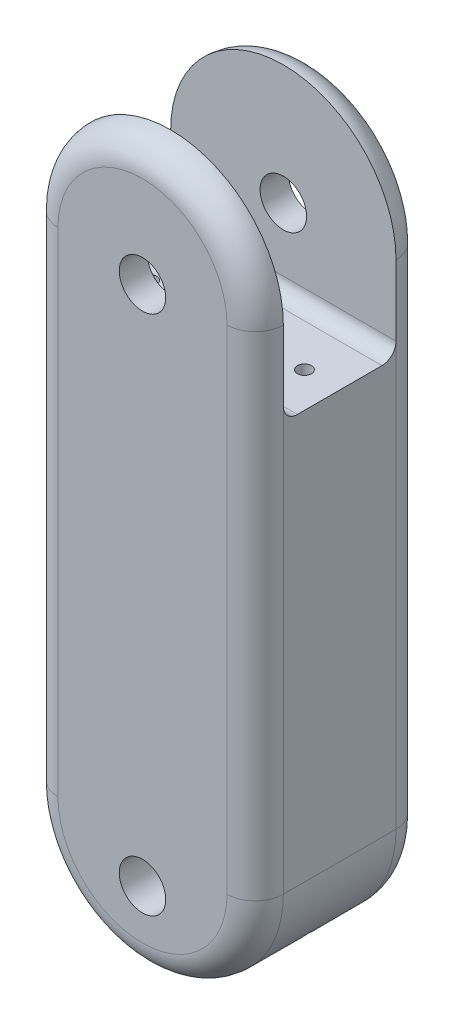
ISO-10303-21;
HEADER;
FILE_DESCRIPTION(('STEP AP214'),'2;1');
FILE_NAME('part.step','',(''),(''),'','','');
FILE_SCHEMA(('AUTOMOTIVE_DESIGN { 1 0 10303 214 1 1 1 1 }'));
ENDSEC;
DATA;
#1=APPLICATION_CONTEXT('core data for automotive mechanical design processes');
#2=APPLICATION_PROTOCOL_DEFINITION('international standard','automotive_design',2000,#1);
#3=PRODUCT_CONTEXT('',#1,'mechanical');
#4=PRODUCT('Part','Part','',(#3));
#5=PRODUCT_RELATED_PRODUCT_CATEGORY('part','',(#4));
#6=PRODUCT_DEFINITION_FORMATION('','',#4);
#7=PRODUCT_DEFINITION_CONTEXT('part definition',#1,'design');
#8=PRODUCT_DEFINITION('design','',#6,#7);
#9=PRODUCT_DEFINITION_SHAPE('','',#8);
#10=(LENGTH_UNIT() NAMED_UNIT(*) SI_UNIT(.MILLI.,.METRE.));
#11=(NAMED_UNIT(*) PLANE_ANGLE_UNIT() SI_UNIT($,.RADIAN.));
#12=(NAMED_UNIT(*) SI_UNIT($,.STERADIAN.) SOLID_ANGLE_UNIT());
#13=UNCERTAINTY_MEASURE_WITH_UNIT(LENGTH_MEASURE(1.E-05),#10,'distance_accuracy_value','');
#14=(GEOMETRIC_REPRESENTATION_CONTEXT(3) GLOBAL_UNCERTAINTY_ASSIGNED_CONTEXT((#13)) GLOBAL_UNIT_ASSIGNED_CONTEXT((#10,
#11,#12)) REPRESENTATION_CONTEXT('',''));
#15=CARTESIAN_POINT('',(0.,0.,0.));
#16=DIRECTION('',(0.,0.,1.));
#17=DIRECTION('',(1.,0.,0.));
#18=AXIS2_PLACEMENT_3D('',#15,#16,#17);
#19=CARTESIAN_POINT('',(0.,-17.5,12.));
#20=DIRECTION('',(0.,0.,-1.));
#21=DIRECTION('',(-1.,0.,0.));
#22=AXIS2_PLACEMENT_3D('',#19,#20,#21);
#23=CYLINDRICAL_SURFACE('',#22,8.);
#24=CARTESIAN_POINT('',(-5.5,-23.3094750193111,5.5));
#25=CARTESIAN_POINT('',(-5.53883256297377,-23.2727099644717,5.49999879672875));
#26=CARTESIAN_POINT('',(-5.57735205571063,-23.2354974126199,5.50451254597471));
#27=CARTESIAN_POINT('',(-5.65269349993185,-23.1612598829696,5.5223075775329));
#28=CARTESIAN_POINT('',(-5.68951035065368,-23.1242357315899,5.53561358205599));
#29=CARTESIAN_POINT('',(-5.75197235969459,-23.0602450287539,5.56706863233885));
#30=CARTESIAN_POINT('',(-5.77821785024123,-23.032949773077,5.58335966591231));
#31=CARTESIAN_POINT('',(-5.8282935252695,-22.9801739318678,5.62156552138405));
#32=CARTESIAN_POINT('',(-5.85212973167694,-22.9546888717723,5.6434658127327));
#33=CARTESIAN_POINT('',(-5.88931760375126,-22.9144655062157,5.68543916786667));
#34=CARTESIAN_POINT('',(-5.90359469668008,-22.8988848324599,5.70388319535616));
#35=CARTESIAN_POINT('',(-5.93001297945982,-22.8698536903953,5.74375981298753));
#36=CARTESIAN_POINT('',(-5.94215707291109,-22.8564003287571,5.76518826807908));
#37=CARTESIAN_POINT('',(-5.96119445181301,-22.8351961083864,5.80587350809099));
#38=CARTESIAN_POINT('',(-5.96865471270215,-22.8268426872149,5.82454715530106));
#39=CARTESIAN_POINT('',(-5.98143524298382,-22.8124876512401,5.8634767593147));
#40=CARTESIAN_POINT('',(-5.98675726165213,-22.8064841141228,5.88373140644802));
#41=CARTESIAN_POINT('',(-5.99489142766223,-22.7972932651513,5.92557021613187));
#42=CARTESIAN_POINT('',(-5.99768115031207,-22.7941311175938,5.94716448210675));
#43=CARTESIAN_POINT('',(-6.00039021795333,-22.7910605903332,5.99075858651718));
#44=CARTESIAN_POINT('',(-6.00031156426424,-22.7911499419984,6.01275813147077));
#45=CARTESIAN_POINT('',(-5.99750441665795,-22.7943312543776,6.05335898481825));
#46=CARTESIAN_POINT('',(-5.99513330798205,-22.7970182476523,6.07201979429985));
#47=CARTESIAN_POINT('',(-5.98843422457456,-22.8045905544454,6.10852080843235));
#48=CARTESIAN_POINT('',(-5.98410540861174,-22.8094768129887,6.12636065667981));
#49=CARTESIAN_POINT('',(-5.97218023126853,-22.8228906924312,6.16612443094749));
#50=CARTESIAN_POINT('',(-5.96399127830456,-22.8320729903809,6.18764849987729));
#51=CARTESIAN_POINT('',(-5.94534255019942,-22.8528588186709,6.22841879831762));
#52=CARTESIAN_POINT('',(-5.93487851417378,-22.8644668905102,6.24766064763471));
#53=CARTESIAN_POINT('',(-5.90754100513332,-22.8945825657835,6.29123292830556));
#54=CARTESIAN_POINT('',(-5.88979990908874,-22.9139661627167,6.31440902025144));
#55=CARTESIAN_POINT('',(-5.85186754242314,-22.9549457188014,6.35635874950463));
#56=CARTESIAN_POINT('',(-5.83167159128333,-22.9765458915543,6.37512377023639));
#57=CARTESIAN_POINT('',(-5.78115974125141,-23.0299199268934,6.4151616669722));
#58=CARTESIAN_POINT('',(-5.7499964295665,-23.0623435370145,6.43449967040374));
#59=CARTESIAN_POINT('',(-5.685354817012,-23.1284000437262,6.46576101145348));
#60=CARTESIAN_POINT('',(-5.65187430109036,-23.1620340822244,6.47767714250449));
#61=CARTESIAN_POINT('',(-5.582742557998,-23.230217005972,6.49441100760347));
#62=CARTESIAN_POINT('',(-5.54706174850995,-23.2647709485254,6.49908592798175));
#63=CARTESIAN_POINT('',(-5.47496826288831,-23.3332829586401,6.50067138267121));
#64=CARTESIAN_POINT('',(-5.43855606152765,-23.3672413875578,6.49758680204824));
#65=CARTESIAN_POINT('',(-5.37138828886743,-23.4287390627056,6.48420183357968));
#66=CARTESIAN_POINT('',(-5.34059474360656,-23.4564833624482,6.47503953853532));
#67=CARTESIAN_POINT('',(-5.28007246941309,-23.5101965434781,6.45022077197024));
#68=CARTESIAN_POINT('',(-5.25034247386237,-23.5361675725655,6.4345723250903));
#69=CARTESIAN_POINT('',(-5.1999351718502,-23.5795978904278,6.40081430911797));
#70=CARTESIAN_POINT('',(-5.17877520682592,-23.5976210210313,6.38415302845264));
#71=CARTESIAN_POINT('',(-5.13858578146666,-23.6315270378339,6.34660273470643));
#72=CARTESIAN_POINT('',(-5.11955351431307,-23.6474127494473,6.32571939597419));
#73=CARTESIAN_POINT('',(-5.08793285310306,-23.673595309223,6.28415951112696));
#74=CARTESIAN_POINT('',(-5.07480756880788,-23.6843803498436,6.26420125834377));
#75=CARTESIAN_POINT('',(-5.05120787557602,-23.70367079713,6.22175244043886));
#76=CARTESIAN_POINT('',(-5.04073247310847,-23.7121770582587,6.19926282899316));
#77=CARTESIAN_POINT('',(-5.02299868867453,-23.7265252507662,6.15202151475749));
#78=CARTESIAN_POINT('',(-5.0157652129964,-23.732346564483,6.12725400337554));
#79=CARTESIAN_POINT('',(-5.00518832922849,-23.7408442913639,6.07638301816265));
#80=CARTESIAN_POINT('',(-5.00184172639809,-23.7435232873139,6.0502806599352));
#81=CARTESIAN_POINT('',(-4.99947572888507,-23.7454177998222,6.00114190299521));
#82=CARTESIAN_POINT('',(-4.99995481900044,-23.745034720617,5.97814330419247));
#83=CARTESIAN_POINT('',(-5.00403554594136,-23.741765381175,5.93261092829059));
#84=CARTESIAN_POINT('',(-5.00763661122035,-23.738879579117,5.91007706688401));
#85=CARTESIAN_POINT('',(-5.01756034911261,-23.7309009327461,5.86685443175315));
#86=CARTESIAN_POINT('',(-5.02378810708933,-23.7258850194844,5.84612917046266));
#87=CARTESIAN_POINT('',(-5.03861228278507,-23.713893852922,5.80615403202124));
#88=CARTESIAN_POINT('',(-5.04720918711048,-23.706918197098,5.78690445900585));
#89=CARTESIAN_POINT('',(-5.06729535570739,-23.6905331154862,5.74844339670633));
#90=CARTESIAN_POINT('',(-5.0789808850677,-23.6809562483116,5.72940656983951));
#91=CARTESIAN_POINT('',(-5.10423221663889,-23.6601203224895,5.69365394991183));
#92=CARTESIAN_POINT('',(-5.11779910542108,-23.6488602914428,5.67693950938438));
#93=CARTESIAN_POINT('',(-5.1531257218155,-23.6193171278474,5.63855456909254));
#94=CARTESIAN_POINT('',(-5.17572801128406,-23.6002291877584,5.6182731424086));
#95=CARTESIAN_POINT('',(-5.22290977634233,-23.5598831551059,5.5827503210757));
#96=CARTESIAN_POINT('',(-5.24749423444183,-23.5386195551745,5.56752215271988));
#97=CARTESIAN_POINT('',(-5.3052046552317,-23.4880442016727,5.53805532760432));
#98=CARTESIAN_POINT('',(-5.33870403095206,-23.4582138910611,5.5254452619614));
#99=CARTESIAN_POINT('',(-5.40616571613404,-23.3970707582578,5.5076480432556));
#100=CARTESIAN_POINT('',(-5.44012718231574,-23.3657604309696,5.50244882830458));
#101=CARTESIAN_POINT('',(-5.48258851597526,-23.3259221672355,5.50022704975757));
#102=CARTESIAN_POINT('',(-5.49130211120065,-23.3177098185159,5.500000269514));
#103=CARTESIAN_POINT('',(-5.5,-23.3094750193111,5.5));
#104=B_SPLINE_CURVE_WITH_KNOTS('',3,(#24,#25,#26,#27,#28,#29,#30,#31,#32,#33,#34,#35,#36,#37,
#38,#39,#40,#41,#42,#43,#44,#45,#46,#47,#48,#49,#50,#51,#52,#53,#54,#55,#56,#57,#58,#59,#60,#61,
#62,#63,#64,#65,#66,#67,#68,#69,#70,#71,#72,#73,#74,#75,#76,#77,#78,#79,#80,#81,#82,#83,#84,#85,
#86,#87,#88,#89,#90,#91,#92,#93,#94,#95,#96,#97,#98,#99,#100,#101,#102,#103),.UNSPECIFIED.,.T.,
.F.,(4,2,2,2,2,2,2,2,2,2,2,2,2,2,2,2,2,2,2,2,2,2,2,2,2,2,2,2,2,2,2,2,2,2,2,2,2,2,2,4),(0.,
0.160400421654199,0.321253790145869,0.444523334107418,0.567476727321627,0.651377206429806,
0.735162573428372,0.800243346398788,0.865270768458753,0.930868575645866,0.996420614899836,
1.05316673131107,1.10993725485826,1.18390480724735,1.25801210158641,1.36254565386125,
1.46728173567749,1.61336869127029,1.75959727566321,1.9086746844034,2.05765826356869,
2.18454483404461,2.31127488733741,2.40814934958351,2.50489447009822,2.58321182065935,
2.6614997637126,2.74037925992162,2.8191938766565,2.88786424252104,2.95652203941122,
3.02288676445781,3.08926513053515,3.1619010670859,3.23457913030363,3.34159226565763,
3.44888332543212,3.5879482408201,3.72678655491656,3.76271374910819),.UNSPECIFIED.);
#105=CARTESIAN_POINT('',(-5.5,-23.3094750193111,5.5));
#106=VERTEX_POINT('',#105);
#107=EDGE_CURVE('E189',#106,#106,#104,.T.);
#108=ORIENTED_EDGE('',*,*,#107,.T.);
#109=EDGE_LOOP('',(#108));
#110=FACE_BOUND('',#109,.T.);
#111=CARTESIAN_POINT('',(5.5,-23.3094750193111,5.5));
#112=CARTESIAN_POINT('',(5.4693514488441,-23.3384911049883,5.50000000587435));
#113=CARTESIAN_POINT('',(5.43847210450164,-23.36726284631,5.50281006000517));
#114=CARTESIAN_POINT('',(5.37681776875911,-23.4238144984797,5.514396895186));
#115=CARTESIAN_POINT('',(5.34604291708679,-23.4515933604469,5.5231798006726));
#116=CARTESIAN_POINT('',(5.28898118698397,-23.5023299890249,5.54579570321477));
#117=CARTESIAN_POINT('',(5.26258579378557,-23.5254744395668,5.55893013922857));
#118=CARTESIAN_POINT('',(5.21140984004913,-23.5697897359983,5.59058798974798));
#119=CARTESIAN_POINT('',(5.18662706108292,-23.5909633112124,5.60910380084695));
#120=CARTESIAN_POINT('',(5.14486940305621,-23.6262467872822,5.64715589441657));
#121=CARTESIAN_POINT('',(5.12736410777177,-23.6408946933835,5.66560842675688));
#122=CARTESIAN_POINT('',(5.09476521273246,-23.6679668363479,5.70596718590084));
#123=CARTESIAN_POINT('',(5.07966885339946,-23.680393619628,5.72786940287191));
#124=CARTESIAN_POINT('',(5.05496645666452,-23.7006069391254,5.7709678851414));
#125=CARTESIAN_POINT('',(5.04486504316474,-23.7088213001872,5.79167810330463));
#126=CARTESIAN_POINT('',(5.02744029982053,-23.7229390368501,5.83498207258515));
#127=CARTESIAN_POINT('',(5.02011571512453,-23.7288434563544,5.85757496727519));
#128=CARTESIAN_POINT('',(5.00867164163467,-23.7380496676546,5.90421081489236));
#129=CARTESIAN_POINT('',(5.00456924464357,-23.7413375816311,5.92826078124137));
#130=CARTESIAN_POINT('',(4.99993625876061,-23.7450497922393,5.97691987557887));
#131=CARTESIAN_POINT('',(4.9994043309931,-23.745475162285,6.00152879049575));
#132=CARTESIAN_POINT('',(5.00182927896958,-23.7435330644825,6.04817625316485));
#133=CARTESIAN_POINT('',(5.00446984575769,-23.7414188103187,6.07024307642512));
#134=CARTESIAN_POINT('',(5.01255691708917,-23.7349257999446,6.11350570602716));
#135=CARTESIAN_POINT('',(5.01800344085411,-23.7305470282218,6.13470150640111));
#136=CARTESIAN_POINT('',(5.03150403005463,-23.7196497408173,6.17604610712552));
#137=CARTESIAN_POINT('',(5.03959787800737,-23.7130985571149,6.19617311370239));
#138=CARTESIAN_POINT('',(5.05796944367835,-23.698151749938,6.23465778292564));
#139=CARTESIAN_POINT('',(5.0682478397992,-23.6897555534746,6.25301489335776));
#140=CARTESIAN_POINT('',(5.09202868876713,-23.6702114407559,6.29000595377509));
#141=CARTESIAN_POINT('',(5.10577635659326,-23.6588479102492,6.30836733457013));
#142=CARTESIAN_POINT('',(5.13499274561139,-23.6345099791823,6.34245402748291));
#143=CARTESIAN_POINT('',(5.15046273133733,-23.621534394223,6.35817738123119));
#144=CARTESIAN_POINT('',(5.19091316720047,-23.587317156449,6.39437581419328));
#145=CARTESIAN_POINT('',(5.21670840067246,-23.5652441225023,6.41316340948417));
#146=CARTESIAN_POINT('',(5.26994860666493,-23.5190442241523,6.44502012893026));
#147=CARTESIAN_POINT('',(5.29739698406806,-23.4949130750909,6.45807695749361));
#148=CARTESIAN_POINT('',(5.36070915948433,-23.4384382910494,6.48169705872594));
#149=CARTESIAN_POINT('',(5.39681087527642,-23.4056615490579,6.49058640002565));
#150=CARTESIAN_POINT('',(5.46896400829757,-23.3389089494067,6.50036446719086));
#151=CARTESIAN_POINT('',(5.50501536169125,-23.3049321482253,6.50124675047985));
#152=CARTESIAN_POINT('',(5.57659257840669,-23.2362101623473,6.49541785729519));
#153=CARTESIAN_POINT('',(5.61210653863349,-23.2014606661879,6.48861322675467));
#154=CARTESIAN_POINT('',(5.68132659211098,-23.1324869306568,6.46736637474426));
#155=CARTESIAN_POINT('',(5.71503358940908,-23.0982624348561,6.45292801256057));
#156=CARTESIAN_POINT('',(5.77260044519866,-23.0388091902603,6.42015809843284));
#157=CARTESIAN_POINT('',(5.7970008785259,-23.0132509935388,6.40337023426044));
#158=CARTESIAN_POINT('',(5.84346338396224,-22.9639796128582,6.36461774416388));
#159=CARTESIAN_POINT('',(5.86552931323936,-22.9402634032928,6.34266185698969));
#160=CARTESIAN_POINT('',(5.90010285479502,-22.9027057381005,6.30069100353768));
#161=CARTESIAN_POINT('',(5.91347638165934,-22.8880547846062,6.28211675388431));
#162=CARTESIAN_POINT('',(5.93807629829934,-22.8609311712768,6.2421522973622));
#163=CARTESIAN_POINT('',(5.9493059092586,-22.8484552460013,6.22076639789113));
#164=CARTESIAN_POINT('',(5.96679316909567,-22.8289317078013,6.18022175325707));
#165=CARTESIAN_POINT('',(5.97360096014232,-22.8212936278479,6.16158804284965));
#166=CARTESIAN_POINT('',(5.98508173890762,-22.8083774913735,6.12288952092716));
#167=CARTESIAN_POINT('',(5.98975650195731,-22.8030974723032,6.1028259156635));
#168=CARTESIAN_POINT('',(5.99663700562942,-22.7953161211715,6.06157561407477));
#169=CARTESIAN_POINT('',(5.99882360261543,-22.7928363348466,6.0403815060472));
#170=CARTESIAN_POINT('',(6.00044893260137,-22.7909937218479,5.99775510339826));
#171=CARTESIAN_POINT('',(5.99988889181081,-22.7916295042589,5.97632291932667));
#172=CARTESIAN_POINT('',(5.99630882591312,-22.7956855816912,5.93652167932407));
#173=CARTESIAN_POINT('',(5.99358612675674,-22.798769300893,5.91808902041954));
#174=CARTESIAN_POINT('',(5.986249151674,-22.8070567726195,5.88210400390448));
#175=CARTESIAN_POINT('',(5.98163405335148,-22.8122614468598,5.86455203274874));
#176=CARTESIAN_POINT('',(5.96892276591119,-22.8265448227128,5.82483813780179));
#177=CARTESIAN_POINT('',(5.96017628186824,-22.8363392570561,5.80314279317929));
#178=CARTESIAN_POINT('',(5.94039943859182,-22.8583462233809,5.76215802277479));
#179=CARTESIAN_POINT('',(5.92936466167342,-22.8705634306452,5.74287336813827));
#180=CARTESIAN_POINT('',(5.90056558653981,-22.9022171769346,5.69918599830357));
#181=CARTESIAN_POINT('',(5.88191596971036,-22.922537260163,5.67601157708692));
#182=CARTESIAN_POINT('',(5.84214902252936,-22.9653596946459,5.63425666408036));
#183=CARTESIAN_POINT('',(5.82102616925349,-22.9878669101264,5.61568675407096));
#184=CARTESIAN_POINT('',(5.76857810956678,-23.0430540017002,5.57655268533856));
#185=CARTESIAN_POINT('',(5.73643621273076,-23.0763375298144,5.55793297801852));
#186=CARTESIAN_POINT('',(5.66995005718209,-23.143927718762,5.52836564591651));
#187=CARTESIAN_POINT('',(5.63560796577752,-23.1782333554681,5.51741059412157));
#188=CARTESIAN_POINT('',(5.56755090286688,-23.2449553312211,5.50344128970893));
#189=CARTESIAN_POINT('',(5.53391677093154,-23.2773647924285,5.49999999349923));
#190=CARTESIAN_POINT('',(5.5,-23.3094750193111,5.5));
#191=B_SPLINE_CURVE_WITH_KNOTS('',3,(#111,#112,#113,#114,#115,#116,#117,#118,#119,#120,#121,
#122,#123,#124,#125,#126,#127,#128,#129,#130,#131,#132,#133,#134,#135,#136,#137,#138,#139,#140,
#141,#142,#143,#144,#145,#146,#147,#148,#149,#150,#151,#152,#153,#154,#155,#156,#157,#158,#159,
#160,#161,#162,#163,#164,#165,#166,#167,#168,#169,#170,#171,#172,#173,#174,#175,#176,#177,#178,
#179,#180,#181,#182,#183,#184,#185,#186,#187,#188,#189,#190),.UNSPECIFIED.,.T.,.F.,(4,2,2,2,2,2,
2,2,2,2,2,2,2,2,2,2,2,2,2,2,2,2,2,2,2,2,2,2,2,2,2,2,2,2,2,2,2,2,2,4),(0.,0.126510708124238,
0.253151333659962,0.365198802151934,0.477088720788121,0.564817183467523,0.65244441513801,
0.725529562643823,0.798581643421685,0.872018653523055,0.945428124241479,1.01208735995122,
1.07874705230062,1.1464584085281,1.21419082304813,1.29070315134876,1.36727203050999,
1.48303462422496,1.59904439139826,1.74696620648305,1.89500703072202,2.04486722192175,
2.19465172260103,2.31165393209814,2.42845970290495,2.50973930985438,2.59089581808844,
2.65442657028613,2.7179043485993,2.78186728306515,2.84580166450636,2.9022102936226,
2.95864346274576,3.03430202145888,3.11010802648153,3.21758820214393,3.32531313875758,
3.47415770184575,3.62285783478946,3.76285905983959),.UNSPECIFIED.);
#192=CARTESIAN_POINT('',(5.5,-23.3094750193111,5.5));
#193=VERTEX_POINT('',#192);
#194=EDGE_CURVE('E188',#193,#193,#191,.T.);
#195=ORIENTED_EDGE('',*,*,#194,.T.);
#196=EDGE_LOOP('',(#195));
#197=FACE_BOUND('',#196,.T.);
#198=DIRECTION('',(0.,0.,-1.));
#199=VECTOR('',#198,1.);
#200=CARTESIAN_POINT('',(8.,-17.5,12.));
#201=LINE('',#200,#199);
#202=CARTESIAN_POINT('',(8.,-17.5,10.));
#203=VERTEX_POINT('',#202);
#204=CARTESIAN_POINT('',(8.,-17.5,2.));
#205=VERTEX_POINT('',#204);
#206=EDGE_CURVE('E145',#203,#205,#201,.T.);
#207=ORIENTED_EDGE('',*,*,#206,.F.);
#208=CARTESIAN_POINT('',(0.,-17.5,10.));
#209=DIRECTION('',(0.,0.,1.));
#210=DIRECTION('',(1.,0.,0.));
#211=AXIS2_PLACEMENT_3D('',#208,#209,#210);
#212=CIRCLE('',#211,8.);
#213=CARTESIAN_POINT('',(-8.,-17.5,10.));
#214=VERTEX_POINT('',#213);
#215=EDGE_CURVE('E303',#203,#214,#212,.F.);
#216=ORIENTED_EDGE('',*,*,#215,.T.);
#217=DIRECTION('',(0.,0.,-1.));
#218=VECTOR('',#217,1.);
#219=CARTESIAN_POINT('',(-8.,-17.5,12.));
#220=LINE('',#219,#218);
#221=CARTESIAN_POINT('',(-8.,-17.5,2.));
#222=VERTEX_POINT('',#221);
#223=EDGE_CURVE('E141',#214,#222,#220,.T.);
#224=ORIENTED_EDGE('',*,*,#223,.T.);
#225=CARTESIAN_POINT('',(0.,-17.5,2.));
#226=DIRECTION('',(0.,0.,1.));
#227=DIRECTION('',(1.,0.,0.));
#228=AXIS2_PLACEMENT_3D('',#225,#226,#227);
#229=CIRCLE('',#228,8.);
#230=EDGE_CURVE('E137',#222,#205,#229,.T.);
#231=ORIENTED_EDGE('',*,*,#230,.T.);
#232=EDGE_LOOP('',(#207,#216,#224,#231));
#233=FACE_BOUND('',#232,.T.);
#234=ADVANCED_FACE('F33',(#110,#197,#233),#23,.T.);
#235=CARTESIAN_POINT('',(8.,-17.5,12.));
#236=DIRECTION('',(-1.,0.,0.));
#237=DIRECTION('',(0.,0.,1.));
#238=AXIS2_PLACEMENT_3D('',#235,#236,#237);
#239=PLANE('',#238);
#240=DIRECTION('',(0.,1.,0.));
#241=VECTOR('',#240,1.);
#242=CARTESIAN_POINT('',(8.,-17.5,2.));
#243=LINE('',#242,#241);
#244=CARTESIAN_POINT('',(8.,12.5,2.));
#245=VERTEX_POINT('',#244);
#246=EDGE_CURVE('E129',#205,#245,#243,.T.);
#247=ORIENTED_EDGE('',*,*,#246,.T.);
#248=CARTESIAN_POINT('',(8.,12.5,3.));
#249=DIRECTION('',(-1.,0.,0.));
#250=DIRECTION('',(0.,0.,1.));
#251=AXIS2_PLACEMENT_3D('',#248,#249,#250);
#252=CIRCLE('',#251,1.);
#253=CARTESIAN_POINT('',(8.,11.5,3.));
#254=VERTEX_POINT('',#253);
#255=EDGE_CURVE('E176',#245,#254,#252,.T.);
#256=ORIENTED_EDGE('',*,*,#255,.T.);
#257=DIRECTION('',(0.,0.,-1.));
#258=VECTOR('',#257,1.);
#259=CARTESIAN_POINT('',(8.,11.5,10.));
#260=LINE('',#259,#258);
#261=CARTESIAN_POINT('',(8.,11.5,9.));
#262=VERTEX_POINT('',#261);
#263=EDGE_CURVE('E281',#262,#254,#260,.T.);
#264=ORIENTED_EDGE('',*,*,#263,.F.);
#265=CARTESIAN_POINT('',(8.,12.5,9.));
#266=DIRECTION('',(-1.,0.,0.));
#267=DIRECTION('',(0.,0.,1.));
#268=AXIS2_PLACEMENT_3D('',#265,#266,#267);
#269=CIRCLE('',#268,1.);
#270=CARTESIAN_POINT('',(8.,12.5,10.));
#271=VERTEX_POINT('',#270);
#272=EDGE_CURVE('E43',#262,#271,#269,.T.);
#273=ORIENTED_EDGE('',*,*,#272,.T.);
#274=DIRECTION('',(0.,1.,0.));
#275=VECTOR('',#274,1.);
#276=CARTESIAN_POINT('',(8.,-17.5,10.));
#277=LINE('',#276,#275);
#278=EDGE_CURVE('E51',#271,#203,#277,.F.);
#279=ORIENTED_EDGE('',*,*,#278,.T.);
#280=ORIENTED_EDGE('',*,*,#206,.T.);
#281=EDGE_LOOP('',(#247,#256,#264,#273,#279,#280));
#282=FACE_BOUND('',#281,.T.);
#283=ADVANCED_FACE('F252',(#282),#239,.F.);
#284=CARTESIAN_POINT('',(-8.,-17.5,12.));
#285=DIRECTION('',(1.,0.,0.));
#286=DIRECTION('',(0.,1.,0.));
#287=AXIS2_PLACEMENT_3D('',#284,#285,#286);
#288=PLANE('',#287);
#289=DIRECTION('',(0.,-1.,0.));
#290=VECTOR('',#289,1.);
#291=CARTESIAN_POINT('',(-8.00000000000001,17.5,10.));
#292=LINE('',#291,#290);
#293=CARTESIAN_POINT('',(-8.00000000000001,12.5,10.));
#294=VERTEX_POINT('',#293);
#295=EDGE_CURVE('E298',#214,#294,#292,.F.);
#296=ORIENTED_EDGE('',*,*,#295,.T.);
#297=CARTESIAN_POINT('',(-8.00000000000001,12.5,9.));
#298=DIRECTION('',(1.,0.,0.));
#299=DIRECTION('',(0.,1.,0.));
#300=AXIS2_PLACEMENT_3D('',#297,#298,#299);
#301=CIRCLE('',#300,1.);
#302=CARTESIAN_POINT('',(-8.00000000000001,11.5,9.));
#303=VERTEX_POINT('',#302);
#304=EDGE_CURVE('E11',#294,#303,#301,.T.);
#305=ORIENTED_EDGE('',*,*,#304,.T.);
#306=DIRECTION('',(0.,0.,-1.));
#307=VECTOR('',#306,1.);
#308=CARTESIAN_POINT('',(-8.00000000000001,11.5,10.));
#309=LINE('',#308,#307);
#310=CARTESIAN_POINT('',(-8.00000000000001,11.5,3.));
#311=VERTEX_POINT('',#310);
#312=EDGE_CURVE('E156',#303,#311,#309,.T.);
#313=ORIENTED_EDGE('',*,*,#312,.T.);
#314=CARTESIAN_POINT('',(-8.00000000000001,12.5,3.));
#315=DIRECTION('',(1.,0.,0.));
#316=DIRECTION('',(0.,1.,0.));
#317=AXIS2_PLACEMENT_3D('',#314,#315,#316);
#318=CIRCLE('',#317,1.);
#319=CARTESIAN_POINT('',(-8.00000000000001,12.5,2.));
#320=VERTEX_POINT('',#319);
#321=EDGE_CURVE('E178',#311,#320,#318,.T.);
#322=ORIENTED_EDGE('',*,*,#321,.T.);
#323=DIRECTION('',(0.,-1.,0.));
#324=VECTOR('',#323,1.);
#325=CARTESIAN_POINT('',(-8.,-17.5,2.));
#326=LINE('',#325,#324);
#327=EDGE_CURVE('E296',#320,#222,#326,.T.);
#328=ORIENTED_EDGE('',*,*,#327,.T.);
#329=ORIENTED_EDGE('',*,*,#223,.F.);
#330=EDGE_LOOP('',(#296,#305,#313,#322,#328,#329));
#331=FACE_BOUND('',#330,.T.);
#332=ADVANCED_FACE('F246',(#331),#288,.F.);
#333=CARTESIAN_POINT('',(0.,-17.5,12.));
#334=DIRECTION('',(0.,0.,1.));
#335=DIRECTION('',(1.,0.,0.));
#336=AXIS2_PLACEMENT_3D('',#333,#334,#335);
#337=PLANE('',#336);
#338=CARTESIAN_POINT('',(0.,-20.,12.));
#339=DIRECTION('',(0.,0.,1.));
#340=DIRECTION('',(1.,0.,0.));
#341=AXIS2_PLACEMENT_3D('',#338,#339,#340);
#342=CIRCLE('',#341,1.65);
#343=CARTESIAN_POINT('',(1.65,-20.,12.));
#344=VERTEX_POINT('',#343);
#345=EDGE_CURVE('E193',#344,#344,#342,.T.);
#346=ORIENTED_EDGE('',*,*,#345,.F.);
#347=EDGE_LOOP('',(#346));
#348=FACE_BOUND('',#347,.T.);
#349=CARTESIAN_POINT('',(0.,17.,12.));
#350=DIRECTION('',(0.,0.,1.));
#351=DIRECTION('',(1.,0.,0.));
#352=AXIS2_PLACEMENT_3D('',#349,#350,#351);
#353=CIRCLE('',#352,1.65);
#354=CARTESIAN_POINT('',(1.65,17.,12.));
#355=VERTEX_POINT('',#354);
#356=EDGE_CURVE('E367',#355,#355,#353,.T.);
#357=ORIENTED_EDGE('',*,*,#356,.F.);
#358=EDGE_LOOP('',(#357));
#359=FACE_BOUND('',#358,.T.);
#360=CARTESIAN_POINT('',(0.,17.5,12.));
#361=DIRECTION('',(0.,0.,1.));
#362=DIRECTION('',(1.,0.,0.));
#363=AXIS2_PLACEMENT_3D('',#360,#361,#362);
#364=CIRCLE('',#363,6.);
#365=CARTESIAN_POINT('',(6.,17.5,12.));
#366=VERTEX_POINT('',#365);
#367=CARTESIAN_POINT('',(-6.00000000000001,17.5,12.));
#368=VERTEX_POINT('',#367);
#369=EDGE_CURVE('E140',#366,#368,#364,.T.);
#370=ORIENTED_EDGE('',*,*,#369,.T.);
#371=DIRECTION('',(0.,-1.,0.));
#372=VECTOR('',#371,1.);
#373=CARTESIAN_POINT('',(-6.,-17.5,12.));
#374=LINE('',#373,#372);
#375=CARTESIAN_POINT('',(-6.,-17.5,12.));
#376=VERTEX_POINT('',#375);
#377=EDGE_CURVE('E293',#368,#376,#374,.T.);
#378=ORIENTED_EDGE('',*,*,#377,.T.);
#379=CARTESIAN_POINT('',(0.,-17.5,12.));
#380=DIRECTION('',(0.,0.,1.));
#381=DIRECTION('',(1.,0.,0.));
#382=AXIS2_PLACEMENT_3D('',#379,#380,#381);
#383=CIRCLE('',#382,6.);
#384=CARTESIAN_POINT('',(6.,-17.5,12.));
#385=VERTEX_POINT('',#384);
#386=EDGE_CURVE('E288',#376,#385,#383,.T.);
#387=ORIENTED_EDGE('',*,*,#386,.T.);
#388=DIRECTION('',(0.,1.,0.));
#389=VECTOR('',#388,1.);
#390=CARTESIAN_POINT('',(6.,17.5,12.));
#391=LINE('',#390,#389);
#392=EDGE_CURVE('E290',#385,#366,#391,.T.);
#393=ORIENTED_EDGE('',*,*,#392,.T.);
#394=EDGE_LOOP('',(#370,#378,#387,#393));
#395=FACE_BOUND('',#394,.T.);
#396=ADVANCED_FACE('F242',(#348,#359,#395),#337,.T.);
#397=CARTESIAN_POINT('',(0.,-17.5,0.));
#398=DIRECTION('',(0.,0.,1.));
#399=DIRECTION('',(1.,0.,0.));
#400=AXIS2_PLACEMENT_3D('',#397,#398,#399);
#401=PLANE('',#400);
#402=CARTESIAN_POINT('',(0.,-20.,0.));
#403=DIRECTION('',(0.,0.,1.));
#404=DIRECTION('',(1.,0.,0.));
#405=AXIS2_PLACEMENT_3D('',#402,#403,#404);
#406=CIRCLE('',#405,1.65);
#407=CARTESIAN_POINT('',(1.65,-20.,0.));
#408=VERTEX_POINT('',#407);
#409=EDGE_CURVE('E370',#408,#408,#406,.T.);
#410=ORIENTED_EDGE('',*,*,#409,.T.);
#411=EDGE_LOOP('',(#410));
#412=FACE_BOUND('',#411,.T.);
#413=CARTESIAN_POINT('',(0.,17.,0.));
#414=DIRECTION('',(0.,0.,1.));
#415=DIRECTION('',(1.,0.,0.));
#416=AXIS2_PLACEMENT_3D('',#413,#414,#415);
#417=CIRCLE('',#416,1.65);
#418=CARTESIAN_POINT('',(1.65,17.,0.));
#419=VERTEX_POINT('',#418);
#420=EDGE_CURVE('E185',#419,#419,#417,.T.);
#421=ORIENTED_EDGE('',*,*,#420,.T.);
#422=EDGE_LOOP('',(#421));
#423=FACE_BOUND('',#422,.T.);
#424=CARTESIAN_POINT('',(0.,17.5,0.));
#425=DIRECTION('',(0.,0.,1.));
#426=DIRECTION('',(1.,0.,0.));
#427=AXIS2_PLACEMENT_3D('',#424,#425,#426);
#428=CIRCLE('',#427,6.);
#429=CARTESIAN_POINT('',(-6.00000000000001,17.5,0.));
#430=VERTEX_POINT('',#429);
#431=CARTESIAN_POINT('',(6.,17.5,0.));
#432=VERTEX_POINT('',#431);
#433=EDGE_CURVE('E309',#430,#432,#428,.F.);
#434=ORIENTED_EDGE('',*,*,#433,.T.);
#435=DIRECTION('',(0.,1.,0.));
#436=VECTOR('',#435,1.);
#437=CARTESIAN_POINT('',(6.,-17.5,0.));
#438=LINE('',#437,#436);
#439=CARTESIAN_POINT('',(6.,-17.5,0.));
#440=VERTEX_POINT('',#439);
#441=EDGE_CURVE('E169',#432,#440,#438,.F.);
#442=ORIENTED_EDGE('',*,*,#441,.T.);
#443=CARTESIAN_POINT('',(0.,-17.5,0.));
#444=DIRECTION('',(0.,0.,1.));
#445=DIRECTION('',(1.,0.,0.));
#446=AXIS2_PLACEMENT_3D('',#443,#444,#445);
#447=CIRCLE('',#446,6.);
#448=CARTESIAN_POINT('',(-6.,-17.5,0.));
#449=VERTEX_POINT('',#448);
#450=EDGE_CURVE('E305',#440,#449,#447,.F.);
#451=ORIENTED_EDGE('',*,*,#450,.T.);
#452=DIRECTION('',(0.,-1.,0.));
#453=VECTOR('',#452,1.);
#454=CARTESIAN_POINT('',(-6.,-17.5,0.));
#455=LINE('',#454,#453);
#456=EDGE_CURVE('E307',#449,#430,#455,.F.);
#457=ORIENTED_EDGE('',*,*,#456,.T.);
#458=EDGE_LOOP('',(#434,#442,#451,#457));
#459=FACE_BOUND('',#458,.T.);
#460=ADVANCED_FACE('F245',(#412,#423,#459),#401,.F.);
#461=CARTESIAN_POINT('',(6.,-17.5,10.));
#462=DIRECTION('',(0.,-1.,0.));
#463=DIRECTION('',(0.,0.,-1.));
#464=AXIS2_PLACEMENT_3D('',#461,#462,#463);
#465=CYLINDRICAL_SURFACE('',#464,2.);
#466=CARTESIAN_POINT('',(6.,-17.5,10.));
#467=DIRECTION('',(0.,-1.,0.));
#468=DIRECTION('',(0.,0.,-1.));
#469=AXIS2_PLACEMENT_3D('',#466,#467,#468);
#470=CIRCLE('',#469,2.);
#471=EDGE_CURVE('E142',#203,#385,#470,.T.);
#472=ORIENTED_EDGE('',*,*,#471,.F.);
#473=ORIENTED_EDGE('',*,*,#278,.F.);
#474=CARTESIAN_POINT('',(8.,17.5,10.));
#475=VERTEX_POINT('',#474);
#476=EDGE_CURVE('E121',#475,#271,#277,.F.);
#477=ORIENTED_EDGE('',*,*,#476,.F.);
#478=CARTESIAN_POINT('',(6.,17.5,10.));
#479=DIRECTION('',(0.,1.,0.));
#480=DIRECTION('',(0.,0.,1.));
#481=AXIS2_PLACEMENT_3D('',#478,#479,#480);
#482=CIRCLE('',#481,2.);
#483=EDGE_CURVE('E135',#366,#475,#482,.T.);
#484=ORIENTED_EDGE('',*,*,#483,.F.);
#485=ORIENTED_EDGE('',*,*,#392,.F.);
#486=EDGE_LOOP('',(#472,#473,#477,#484,#485));
#487=FACE_BOUND('',#486,.T.);
#488=ADVANCED_FACE('F133',(#487),#465,.T.);
#489=CARTESIAN_POINT('',(0.,17.5,10.));
#490=DIRECTION('',(0.,0.,1.));
#491=DIRECTION('',(1.,0.,0.));
#492=AXIS2_PLACEMENT_3D('',#489,#490,#491);
#493=TOROIDAL_SURFACE('',#492,6.,2.);
#494=ORIENTED_EDGE('',*,*,#483,.T.);
#495=CARTESIAN_POINT('',(0.,17.5,10.));
#496=DIRECTION('',(0.,0.,1.));
#497=DIRECTION('',(1.,0.,0.));
#498=AXIS2_PLACEMENT_3D('',#495,#496,#497);
#499=CIRCLE('',#498,8.);
#500=CARTESIAN_POINT('',(-8.00000000000001,17.5,10.));
#501=VERTEX_POINT('',#500);
#502=EDGE_CURVE('E118',#501,#475,#499,.F.);
#503=ORIENTED_EDGE('',*,*,#502,.F.);
#504=CARTESIAN_POINT('',(-6.00000000000001,17.5,10.));
#505=DIRECTION('',(0.,-1.,0.));
#506=DIRECTION('',(0.,0.,-1.));
#507=AXIS2_PLACEMENT_3D('',#504,#505,#506);
#508=CIRCLE('',#507,2.);
#509=EDGE_CURVE('E148',#368,#501,#508,.T.);
#510=ORIENTED_EDGE('',*,*,#509,.F.);
#511=ORIENTED_EDGE('',*,*,#369,.F.);
#512=EDGE_LOOP('',(#494,#503,#510,#511));
#513=FACE_BOUND('',#512,.T.);
#514=ADVANCED_FACE('F139',(#513),#493,.T.);
#515=CARTESIAN_POINT('',(0.,-17.5,10.));
#516=DIRECTION('',(0.,0.,1.));
#517=DIRECTION('',(1.,0.,0.));
#518=AXIS2_PLACEMENT_3D('',#515,#516,#517);
#519=TOROIDAL_SURFACE('',#518,6.,2.);
#520=ORIENTED_EDGE('',*,*,#471,.T.);
#521=ORIENTED_EDGE('',*,*,#386,.F.);
#522=CARTESIAN_POINT('',(-6.,-17.5,10.));
#523=DIRECTION('',(0.,1.,0.));
#524=DIRECTION('',(0.,0.,1.));
#525=AXIS2_PLACEMENT_3D('',#522,#523,#524);
#526=CIRCLE('',#525,2.);
#527=EDGE_CURVE('E164',#214,#376,#526,.T.);
#528=ORIENTED_EDGE('',*,*,#527,.F.);
#529=ORIENTED_EDGE('',*,*,#215,.F.);
#530=EDGE_LOOP('',(#520,#521,#528,#529));
#531=FACE_BOUND('',#530,.T.);
#532=ADVANCED_FACE('F323',(#531),#519,.T.);
#533=CARTESIAN_POINT('',(-6.,-17.5,10.));
#534=DIRECTION('',(0.,1.,0.));
#535=DIRECTION('',(-1.,0.,0.));
#536=AXIS2_PLACEMENT_3D('',#533,#534,#535);
#537=CYLINDRICAL_SURFACE('',#536,2.);
#538=ORIENTED_EDGE('',*,*,#509,.T.);
#539=DIRECTION('',(0.,-1.,0.));
#540=VECTOR('',#539,1.);
#541=CARTESIAN_POINT('',(-8.00000000000001,11.5,10.));
#542=LINE('',#541,#540);
#543=EDGE_CURVE('E124',#501,#294,#542,.T.);
#544=ORIENTED_EDGE('',*,*,#543,.T.);
#545=ORIENTED_EDGE('',*,*,#295,.F.);
#546=ORIENTED_EDGE('',*,*,#527,.T.);
#547=ORIENTED_EDGE('',*,*,#377,.F.);
#548=EDGE_LOOP('',(#538,#544,#545,#546,#547));
#549=FACE_BOUND('',#548,.T.);
#550=ADVANCED_FACE('F315',(#549),#537,.T.);
#551=CARTESIAN_POINT('',(-6.,-17.5,2.));
#552=DIRECTION('',(0.,-1.,0.));
#553=DIRECTION('',(1.,0.,0.));
#554=AXIS2_PLACEMENT_3D('',#551,#552,#553);
#555=CYLINDRICAL_SURFACE('',#554,2.);
#556=CARTESIAN_POINT('',(-6.00000000000001,17.5,2.));
#557=DIRECTION('',(0.,1.,0.));
#558=DIRECTION('',(0.,0.,1.));
#559=AXIS2_PLACEMENT_3D('',#556,#557,#558);
#560=CIRCLE('',#559,2.);
#561=CARTESIAN_POINT('',(-8.00000000000001,17.5,2.));
#562=VERTEX_POINT('',#561);
#563=EDGE_CURVE('E158',#430,#562,#560,.T.);
#564=ORIENTED_EDGE('',*,*,#563,.F.);
#565=ORIENTED_EDGE('',*,*,#456,.F.);
#566=CARTESIAN_POINT('',(-6.,-17.5,2.));
#567=DIRECTION('',(0.,-1.,0.));
#568=DIRECTION('',(0.,0.,-1.));
#569=AXIS2_PLACEMENT_3D('',#566,#567,#568);
#570=CIRCLE('',#569,2.);
#571=EDGE_CURVE('E161',#222,#449,#570,.T.);
#572=ORIENTED_EDGE('',*,*,#571,.F.);
#573=ORIENTED_EDGE('',*,*,#327,.F.);
#574=EDGE_CURVE('E277',#562,#320,#326,.T.);
#575=ORIENTED_EDGE('',*,*,#574,.F.);
#576=EDGE_LOOP('',(#564,#565,#572,#573,#575));
#577=FACE_BOUND('',#576,.T.);
#578=ADVANCED_FACE('F330',(#577),#555,.T.);
#579=CARTESIAN_POINT('',(0.,-17.5,2.));
#580=DIRECTION('',(0.,0.,1.));
#581=DIRECTION('',(1.,0.,0.));
#582=AXIS2_PLACEMENT_3D('',#579,#580,#581);
#583=TOROIDAL_SURFACE('',#582,6.,2.);
#584=ORIENTED_EDGE('',*,*,#571,.T.);
#585=ORIENTED_EDGE('',*,*,#450,.F.);
#586=CARTESIAN_POINT('',(6.,-17.5,2.));
#587=DIRECTION('',(0.,1.,0.));
#588=DIRECTION('',(0.,0.,1.));
#589=AXIS2_PLACEMENT_3D('',#586,#587,#588);
#590=CIRCLE('',#589,2.);
#591=EDGE_CURVE('E155',#205,#440,#590,.T.);
#592=ORIENTED_EDGE('',*,*,#591,.F.);
#593=ORIENTED_EDGE('',*,*,#230,.F.);
#594=EDGE_LOOP('',(#584,#585,#592,#593));
#595=FACE_BOUND('',#594,.T.);
#596=ADVANCED_FACE('F335',(#595),#583,.T.);
#597=CARTESIAN_POINT('',(0.,17.5,2.));
#598=DIRECTION('',(0.,0.,1.));
#599=DIRECTION('',(1.,0.,0.));
#600=AXIS2_PLACEMENT_3D('',#597,#598,#599);
#601=TOROIDAL_SURFACE('',#600,6.,2.);
#602=ORIENTED_EDGE('',*,*,#563,.T.);
#603=CARTESIAN_POINT('',(0.,17.5,2.));
#604=DIRECTION('',(0.,0.,1.));
#605=DIRECTION('',(1.,0.,0.));
#606=AXIS2_PLACEMENT_3D('',#603,#604,#605);
#607=CIRCLE('',#606,8.);
#608=CARTESIAN_POINT('',(8.,17.5,2.));
#609=VERTEX_POINT('',#608);
#610=EDGE_CURVE('E130',#609,#562,#607,.T.);
#611=ORIENTED_EDGE('',*,*,#610,.F.);
#612=CARTESIAN_POINT('',(6.,17.5,2.));
#613=DIRECTION('',(0.,-1.,0.));
#614=DIRECTION('',(0.,0.,-1.));
#615=AXIS2_PLACEMENT_3D('',#612,#613,#614);
#616=CIRCLE('',#615,2.);
#617=EDGE_CURVE('E152',#432,#609,#616,.T.);
#618=ORIENTED_EDGE('',*,*,#617,.F.);
#619=ORIENTED_EDGE('',*,*,#433,.F.);
#620=EDGE_LOOP('',(#602,#611,#618,#619));
#621=FACE_BOUND('',#620,.T.);
#622=ADVANCED_FACE('F339',(#621),#601,.T.);
#623=CARTESIAN_POINT('',(6.,-17.5,2.));
#624=DIRECTION('',(0.,1.,0.));
#625=DIRECTION('',(0.,0.,1.));
#626=AXIS2_PLACEMENT_3D('',#623,#624,#625);
#627=CYLINDRICAL_SURFACE('',#626,2.);
#628=ORIENTED_EDGE('',*,*,#591,.T.);
#629=ORIENTED_EDGE('',*,*,#441,.F.);
#630=ORIENTED_EDGE('',*,*,#617,.T.);
#631=DIRECTION('',(0.,1.,0.));
#632=VECTOR('',#631,1.);
#633=CARTESIAN_POINT('',(8.,11.5,2.));
#634=LINE('',#633,#632);
#635=EDGE_CURVE('E275',#245,#609,#634,.T.);
#636=ORIENTED_EDGE('',*,*,#635,.F.);
#637=ORIENTED_EDGE('',*,*,#246,.F.);
#638=EDGE_LOOP('',(#628,#629,#630,#636,#637));
#639=FACE_BOUND('',#638,.T.);
#640=ADVANCED_FACE('F240',(#639),#627,.T.);
#641=CARTESIAN_POINT('',(-8.00000000000001,11.5,10.));
#642=DIRECTION('',(0.,0.,1.));
#643=DIRECTION('',(1.,0.,0.));
#644=AXIS2_PLACEMENT_3D('',#641,#642,#643);
#645=PLANE('',#644);
#646=CARTESIAN_POINT('',(0.,17.,10.));
#647=DIRECTION('',(0.,0.,1.));
#648=DIRECTION('',(1.,0.,0.));
#649=AXIS2_PLACEMENT_3D('',#646,#647,#648);
#650=CIRCLE('',#649,1.65);
#651=CARTESIAN_POINT('',(1.65,17.,10.));
#652=VERTEX_POINT('',#651);
#653=EDGE_CURVE('E184',#652,#652,#650,.T.);
#654=ORIENTED_EDGE('',*,*,#653,.T.);
#655=EDGE_LOOP('',(#654));
#656=FACE_BOUND('',#655,.T.);
#657=ORIENTED_EDGE('',*,*,#476,.T.);
#658=DIRECTION('',(1.,0.,0.));
#659=VECTOR('',#658,1.);
#660=CARTESIAN_POINT('',(-8.00000000000001,12.5,10.));
#661=LINE('',#660,#659);
#662=EDGE_CURVE('E174',#271,#294,#661,.F.);
#663=ORIENTED_EDGE('',*,*,#662,.T.);
#664=ORIENTED_EDGE('',*,*,#543,.F.);
#665=ORIENTED_EDGE('',*,*,#502,.T.);
#666=EDGE_LOOP('',(#657,#663,#664,#665));
#667=FACE_BOUND('',#666,.T.);
#668=ADVANCED_FACE('F119',(#656,#667),#645,.F.);
#669=CARTESIAN_POINT('',(-8.00000000000001,11.5,2.));
#670=DIRECTION('',(0.,0.,-1.));
#671=DIRECTION('',(-1.,0.,0.));
#672=AXIS2_PLACEMENT_3D('',#669,#670,#671);
#673=PLANE('',#672);
#674=CARTESIAN_POINT('',(0.,17.,2.));
#675=DIRECTION('',(0.,0.,-1.));
#676=DIRECTION('',(-1.,0.,0.));
#677=AXIS2_PLACEMENT_3D('',#674,#675,#676);
#678=CIRCLE('',#677,1.65);
#679=CARTESIAN_POINT('',(-1.65,17.,2.));
#680=VERTEX_POINT('',#679);
#681=EDGE_CURVE('E182',#680,#680,#678,.T.);
#682=ORIENTED_EDGE('',*,*,#681,.T.);
#683=EDGE_LOOP('',(#682));
#684=FACE_BOUND('',#683,.T.);
#685=ORIENTED_EDGE('',*,*,#574,.T.);
#686=DIRECTION('',(1.,0.,0.));
#687=VECTOR('',#686,1.);
#688=CARTESIAN_POINT('',(8.,12.5,2.));
#689=LINE('',#688,#687);
#690=EDGE_CURVE('E165',#320,#245,#689,.T.);
#691=ORIENTED_EDGE('',*,*,#690,.T.);
#692=ORIENTED_EDGE('',*,*,#635,.T.);
#693=ORIENTED_EDGE('',*,*,#610,.T.);
#694=EDGE_LOOP('',(#685,#691,#692,#693));
#695=FACE_BOUND('',#694,.T.);
#696=ADVANCED_FACE('F229',(#684,#695),#673,.F.);
#697=CARTESIAN_POINT('',(-8.00000000000001,11.5,10.));
#698=DIRECTION('',(0.,-1.,0.));
#699=DIRECTION('',(0.,0.,-1.));
#700=AXIS2_PLACEMENT_3D('',#697,#698,#699);
#701=PLANE('',#700);
#702=CARTESIAN_POINT('',(-5.5,11.5,6.));
#703=DIRECTION('',(0.,-1.,0.));
#704=DIRECTION('',(0.,0.,-1.));
#705=AXIS2_PLACEMENT_3D('',#702,#703,#704);
#706=CIRCLE('',#705,0.500000000000001);
#707=CARTESIAN_POINT('',(-5.5,11.5,5.5));
#708=VERTEX_POINT('',#707);
#709=EDGE_CURVE('E37',#708,#708,#706,.T.);
#710=ORIENTED_EDGE('',*,*,#709,.T.);
#711=EDGE_LOOP('',(#710));
#712=FACE_BOUND('',#711,.T.);
#713=CARTESIAN_POINT('',(5.5,11.5,6.));
#714=DIRECTION('',(0.,-1.,0.));
#715=DIRECTION('',(0.,0.,-1.));
#716=AXIS2_PLACEMENT_3D('',#713,#714,#715);
#717=CIRCLE('',#716,0.500000000000001);
#718=CARTESIAN_POINT('',(5.5,11.5,5.5));
#719=VERTEX_POINT('',#718);
#720=EDGE_CURVE('E186',#719,#719,#717,.T.);
#721=ORIENTED_EDGE('',*,*,#720,.T.);
#722=EDGE_LOOP('',(#721));
#723=FACE_BOUND('',#722,.T.);
#724=ORIENTED_EDGE('',*,*,#263,.T.);
#725=DIRECTION('',(1.,0.,0.));
#726=VECTOR('',#725,1.);
#727=CARTESIAN_POINT('',(-8.00000000000001,11.5,3.));
#728=LINE('',#727,#726);
#729=EDGE_CURVE('E172',#254,#311,#728,.F.);
#730=ORIENTED_EDGE('',*,*,#729,.T.);
#731=ORIENTED_EDGE('',*,*,#312,.F.);
#732=DIRECTION('',(1.,0.,0.));
#733=VECTOR('',#732,1.);
#734=CARTESIAN_POINT('',(8.,11.5,9.));
#735=LINE('',#734,#733);
#736=EDGE_CURVE('E168',#303,#262,#735,.T.);
#737=ORIENTED_EDGE('',*,*,#736,.T.);
#738=EDGE_LOOP('',(#724,#730,#731,#737));
#739=FACE_BOUND('',#738,.T.);
#740=ADVANCED_FACE('F232',(#712,#723,#739),#701,.F.);
#741=CARTESIAN_POINT('',(-8.00000000000001,12.5,3.));
#742=DIRECTION('',(-1.,0.,0.));
#743=DIRECTION('',(0.,0.,1.));
#744=AXIS2_PLACEMENT_3D('',#741,#742,#743);
#745=CYLINDRICAL_SURFACE('',#744,1.);
#746=ORIENTED_EDGE('',*,*,#321,.F.);
#747=ORIENTED_EDGE('',*,*,#729,.F.);
#748=ORIENTED_EDGE('',*,*,#255,.F.);
#749=ORIENTED_EDGE('',*,*,#690,.F.);
#750=EDGE_LOOP('',(#746,#747,#748,#749));
#751=FACE_BOUND('',#750,.T.);
#752=ADVANCED_FACE('F236',(#751),#745,.F.);
#753=CARTESIAN_POINT('',(-8.00000000000001,12.5,9.));
#754=DIRECTION('',(-1.,0.,0.));
#755=DIRECTION('',(0.,0.,1.));
#756=AXIS2_PLACEMENT_3D('',#753,#754,#755);
#757=CYLINDRICAL_SURFACE('',#756,1.);
#758=ORIENTED_EDGE('',*,*,#304,.F.);
#759=ORIENTED_EDGE('',*,*,#662,.F.);
#760=ORIENTED_EDGE('',*,*,#272,.F.);
#761=ORIENTED_EDGE('',*,*,#736,.F.);
#762=EDGE_LOOP('',(#758,#759,#760,#761));
#763=FACE_BOUND('',#762,.T.);
#764=ADVANCED_FACE('F35',(#763),#757,.F.);
#765=CARTESIAN_POINT('',(0.,17.,0.));
#766=DIRECTION('',(0.,0.,1.));
#767=DIRECTION('',(1.,0.,0.));
#768=AXIS2_PLACEMENT_3D('',#765,#766,#767);
#769=CYLINDRICAL_SURFACE('',#768,1.65);
#770=ORIENTED_EDGE('',*,*,#420,.F.);
#771=EDGE_LOOP('',(#770));
#772=FACE_BOUND('',#771,.T.);
#773=ORIENTED_EDGE('',*,*,#681,.F.);
#774=EDGE_LOOP('',(#773));
#775=FACE_BOUND('',#774,.T.);
#776=ADVANCED_FACE('F227',(#772,#775),#769,.F.);
#777=ORIENTED_EDGE('',*,*,#356,.T.);
#778=EDGE_LOOP('',(#777));
#779=FACE_BOUND('',#778,.T.);
#780=ORIENTED_EDGE('',*,*,#653,.F.);
#781=EDGE_LOOP('',(#780));
#782=FACE_BOUND('',#781,.T.);
#783=ADVANCED_FACE('F223',(#779,#782),#769,.F.);
#784=CARTESIAN_POINT('',(0.,-20.,0.));
#785=DIRECTION('',(0.,0.,1.));
#786=DIRECTION('',(1.,0.,0.));
#787=AXIS2_PLACEMENT_3D('',#784,#785,#786);
#788=CYLINDRICAL_SURFACE('',#787,1.65);
#789=ORIENTED_EDGE('',*,*,#409,.F.);
#790=EDGE_LOOP('',(#789));
#791=FACE_BOUND('',#790,.T.);
#792=ORIENTED_EDGE('',*,*,#345,.T.);
#793=EDGE_LOOP('',(#792));
#794=FACE_BOUND('',#793,.T.);
#795=ADVANCED_FACE('F219',(#791,#794),#788,.F.);
#796=CARTESIAN_POINT('',(5.5,25.5,6.));
#797=DIRECTION('',(0.,-1.,0.));
#798=DIRECTION('',(0.,0.,-1.));
#799=AXIS2_PLACEMENT_3D('',#796,#797,#798);
#800=CYLINDRICAL_SURFACE('',#799,0.500000000000001);
#801=ORIENTED_EDGE('',*,*,#720,.F.);
#802=EDGE_LOOP('',(#801));
#803=FACE_BOUND('',#802,.T.);
#804=ORIENTED_EDGE('',*,*,#194,.F.);
#805=EDGE_LOOP('',(#804));
#806=FACE_BOUND('',#805,.T.);
#807=ADVANCED_FACE('F214',(#803,#806),#800,.F.);
#808=CARTESIAN_POINT('',(-5.5,25.5,6.));
#809=DIRECTION('',(0.,-1.,0.));
#810=DIRECTION('',(0.,0.,-1.));
#811=AXIS2_PLACEMENT_3D('',#808,#809,#810);
#812=CYLINDRICAL_SURFACE('',#811,0.500000000000001);
#813=ORIENTED_EDGE('',*,*,#709,.F.);
#814=EDGE_LOOP('',(#813));
#815=FACE_BOUND('',#814,.T.);
#816=ORIENTED_EDGE('',*,*,#107,.F.);
#817=EDGE_LOOP('',(#816));
#818=FACE_BOUND('',#817,.T.);
#819=ADVANCED_FACE('F211',(#815,#818),#812,.F.);
#820=CLOSED_SHELL('',(#234,#283,#332,#396,#460,#488,#514,#532,#550,#578,#596,#622,#640,#668,
#696,#740,#752,#764,#776,#783,#795,#807,#819));
#821=MANIFOLD_SOLID_BREP('B2',#820);
#822=ADVANCED_BREP_SHAPE_REPRESENTATION('',(#18,#821),#14);
#823=SHAPE_DEFINITION_REPRESENTATION(#9,#822);
ENDSEC;
END-ISO-10303-21;
